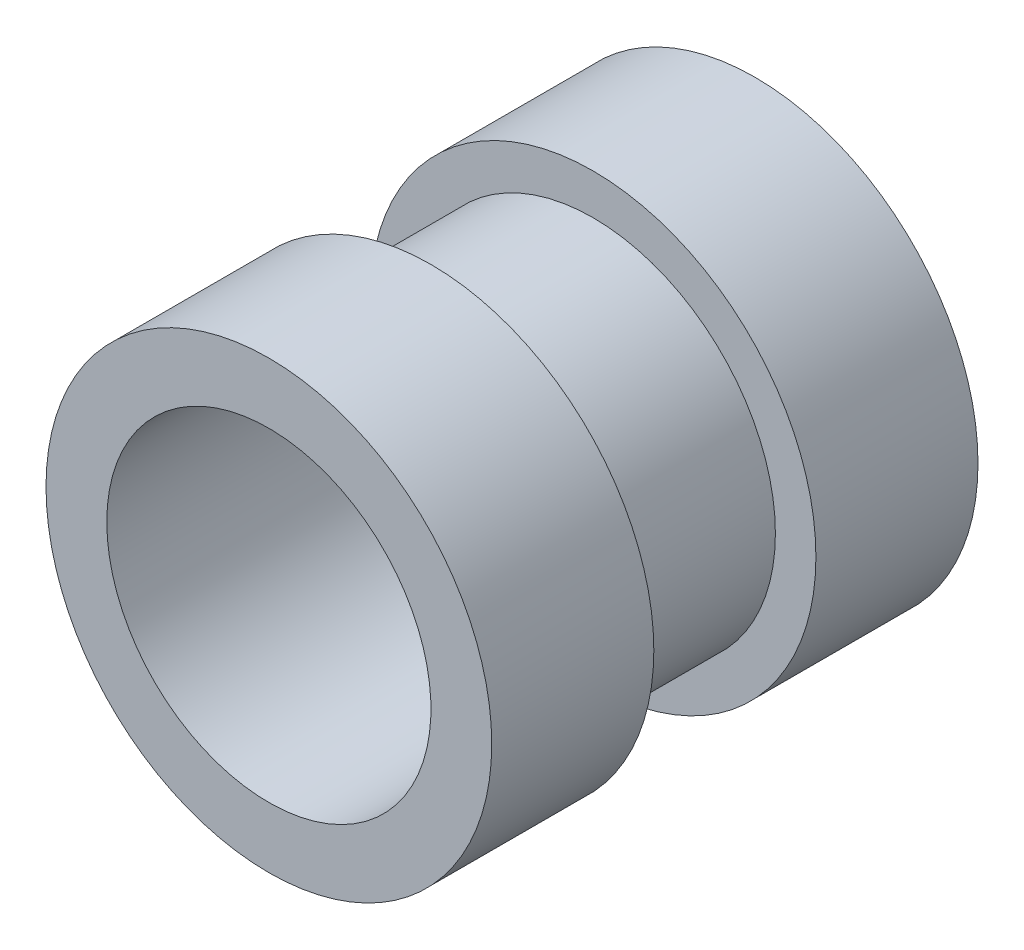
ISO-10303-21;
HEADER;
FILE_DESCRIPTION(('STEP AP214'),'2;1');
FILE_NAME('part.step','',(''),(''),'','','');
FILE_SCHEMA(('AUTOMOTIVE_DESIGN { 1 0 10303 214 1 1 1 1 }'));
ENDSEC;
DATA;
#1=APPLICATION_CONTEXT('core data for automotive mechanical design processes');
#2=APPLICATION_PROTOCOL_DEFINITION('international standard','automotive_design',2000,#1);
#3=PRODUCT_CONTEXT('',#1,'mechanical');
#4=PRODUCT('Part','Part','',(#3));
#5=PRODUCT_RELATED_PRODUCT_CATEGORY('part','',(#4));
#6=PRODUCT_DEFINITION_FORMATION('','',#4);
#7=PRODUCT_DEFINITION_CONTEXT('part definition',#1,'design');
#8=PRODUCT_DEFINITION('design','',#6,#7);
#9=PRODUCT_DEFINITION_SHAPE('','',#8);
#10=(LENGTH_UNIT() NAMED_UNIT(*) SI_UNIT(.MILLI.,.METRE.));
#11=(NAMED_UNIT(*) PLANE_ANGLE_UNIT() SI_UNIT($,.RADIAN.));
#12=(NAMED_UNIT(*) SI_UNIT($,.STERADIAN.) SOLID_ANGLE_UNIT());
#13=UNCERTAINTY_MEASURE_WITH_UNIT(LENGTH_MEASURE(1.E-05),#10,'distance_accuracy_value','');
#14=(GEOMETRIC_REPRESENTATION_CONTEXT(3) GLOBAL_UNCERTAINTY_ASSIGNED_CONTEXT((#13)) GLOBAL_UNIT_ASSIGNED_CONTEXT((#10,
#11,#12)) REPRESENTATION_CONTEXT('',''));
#15=CARTESIAN_POINT('',(0.,0.,0.));
#16=DIRECTION('',(0.,0.,1.));
#17=DIRECTION('',(1.,0.,0.));
#18=AXIS2_PLACEMENT_3D('',#15,#16,#17);
#19=CARTESIAN_POINT('',(0.,0.,0.));
#20=DIRECTION('',(0.,0.,-1.));
#21=DIRECTION('',(-1.,0.,0.));
#22=AXIS2_PLACEMENT_3D('',#19,#20,#21);
#23=PLANE('',#22);
#24=CARTESIAN_POINT('',(0.,0.,0.));
#25=DIRECTION('',(0.,0.,-1.));
#26=DIRECTION('',(-1.,0.,0.));
#27=AXIS2_PLACEMENT_3D('',#24,#25,#26);
#28=CIRCLE('',#27,2.);
#29=CARTESIAN_POINT('',(-2.,0.,0.));
#30=VERTEX_POINT('',#29);
#31=EDGE_CURVE('E60',#30,#30,#28,.T.);
#32=ORIENTED_EDGE('',*,*,#31,.T.);
#33=EDGE_LOOP('',(#32));
#34=FACE_BOUND('',#33,.T.);
#35=CARTESIAN_POINT('',(0.,0.,0.));
#36=DIRECTION('',(0.,0.,-1.));
#37=DIRECTION('',(-1.,0.,0.));
#38=AXIS2_PLACEMENT_3D('',#35,#36,#37);
#39=CIRCLE('',#38,2.75);
#40=CARTESIAN_POINT('',(-2.75,0.,0.));
#41=VERTEX_POINT('',#40);
#42=EDGE_CURVE('E10',#41,#41,#39,.T.);
#43=ORIENTED_EDGE('',*,*,#42,.F.);
#44=EDGE_LOOP('',(#43));
#45=FACE_BOUND('',#44,.T.);
#46=ADVANCED_FACE('F35',(#34,#45),#23,.F.);
#47=CARTESIAN_POINT('',(0.,0.,-11.944023292159));
#48=DIRECTION('',(0.,0.,-1.));
#49=DIRECTION('',(-1.,0.,0.));
#50=AXIS2_PLACEMENT_3D('',#47,#48,#49);
#51=CYLINDRICAL_SURFACE('',#50,2.75);
#52=CARTESIAN_POINT('',(0.,0.,-2.));
#53=DIRECTION('',(0.,0.,-1.));
#54=DIRECTION('',(-1.,0.,0.));
#55=AXIS2_PLACEMENT_3D('',#52,#53,#54);
#56=CIRCLE('',#55,2.75);
#57=CARTESIAN_POINT('',(-2.75,0.,-2.));
#58=VERTEX_POINT('',#57);
#59=EDGE_CURVE('E41',#58,#58,#56,.T.);
#60=ORIENTED_EDGE('',*,*,#59,.F.);
#61=EDGE_LOOP('',(#60));
#62=FACE_BOUND('',#61,.T.);
#63=ORIENTED_EDGE('',*,*,#42,.T.);
#64=EDGE_LOOP('',(#63));
#65=FACE_BOUND('',#64,.T.);
#66=ADVANCED_FACE('F101',(#62,#65),#51,.T.);
#67=CARTESIAN_POINT('',(2.75,0.,-2.));
#68=DIRECTION('',(0.,0.,1.));
#69=DIRECTION('',(1.,0.,0.));
#70=AXIS2_PLACEMENT_3D('',#67,#68,#69);
#71=PLANE('',#70);
#72=CARTESIAN_POINT('',(0.,0.,-2.));
#73=DIRECTION('',(0.,0.,-1.));
#74=DIRECTION('',(-1.,0.,0.));
#75=AXIS2_PLACEMENT_3D('',#72,#73,#74);
#76=CIRCLE('',#75,2.25);
#77=CARTESIAN_POINT('',(-2.25,0.,-2.));
#78=VERTEX_POINT('',#77);
#79=EDGE_CURVE('E45',#78,#78,#76,.T.);
#80=ORIENTED_EDGE('',*,*,#79,.F.);
#81=EDGE_LOOP('',(#80));
#82=FACE_BOUND('',#81,.T.);
#83=ORIENTED_EDGE('',*,*,#59,.T.);
#84=EDGE_LOOP('',(#83));
#85=FACE_BOUND('',#84,.T.);
#86=ADVANCED_FACE('F96',(#82,#85),#71,.F.);
#87=CARTESIAN_POINT('',(0.,0.,-11.944023292159));
#88=DIRECTION('',(0.,0.,-1.));
#89=DIRECTION('',(-1.,0.,0.));
#90=AXIS2_PLACEMENT_3D('',#87,#88,#89);
#91=CYLINDRICAL_SURFACE('',#90,2.25);
#92=CARTESIAN_POINT('',(0.,0.,-4.));
#93=DIRECTION('',(0.,0.,-1.));
#94=DIRECTION('',(-1.,0.,0.));
#95=AXIS2_PLACEMENT_3D('',#92,#93,#94);
#96=CIRCLE('',#95,2.25);
#97=CARTESIAN_POINT('',(-2.25,0.,-4.));
#98=VERTEX_POINT('',#97);
#99=EDGE_CURVE('E49',#98,#98,#96,.T.);
#100=ORIENTED_EDGE('',*,*,#99,.F.);
#101=EDGE_LOOP('',(#100));
#102=FACE_BOUND('',#101,.T.);
#103=ORIENTED_EDGE('',*,*,#79,.T.);
#104=EDGE_LOOP('',(#103));
#105=FACE_BOUND('',#104,.T.);
#106=ADVANCED_FACE('F90',(#102,#105),#91,.T.);
#107=CARTESIAN_POINT('',(2.25,0.,-4.));
#108=DIRECTION('',(0.,0.,-1.));
#109=DIRECTION('',(-1.,0.,0.));
#110=AXIS2_PLACEMENT_3D('',#107,#108,#109);
#111=PLANE('',#110);
#112=CARTESIAN_POINT('',(0.,0.,-4.));
#113=DIRECTION('',(0.,0.,-1.));
#114=DIRECTION('',(-1.,0.,0.));
#115=AXIS2_PLACEMENT_3D('',#112,#113,#114);
#116=CIRCLE('',#115,2.75);
#117=CARTESIAN_POINT('',(-2.75,0.,-4.));
#118=VERTEX_POINT('',#117);
#119=EDGE_CURVE('E54',#118,#118,#116,.T.);
#120=ORIENTED_EDGE('',*,*,#119,.F.);
#121=EDGE_LOOP('',(#120));
#122=FACE_BOUND('',#121,.T.);
#123=ORIENTED_EDGE('',*,*,#99,.T.);
#124=EDGE_LOOP('',(#123));
#125=FACE_BOUND('',#124,.T.);
#126=ADVANCED_FACE('F84',(#122,#125),#111,.F.);
#127=CARTESIAN_POINT('',(0.,0.,-11.944023292159));
#128=DIRECTION('',(0.,0.,-1.));
#129=DIRECTION('',(-1.,0.,0.));
#130=AXIS2_PLACEMENT_3D('',#127,#128,#129);
#131=CYLINDRICAL_SURFACE('',#130,2.75);
#132=CARTESIAN_POINT('',(0.,0.,-6.));
#133=DIRECTION('',(0.,0.,-1.));
#134=DIRECTION('',(-1.,0.,0.));
#135=AXIS2_PLACEMENT_3D('',#132,#133,#134);
#136=CIRCLE('',#135,2.75);
#137=CARTESIAN_POINT('',(-2.75,0.,-6.));
#138=VERTEX_POINT('',#137);
#139=EDGE_CURVE('E57',#138,#138,#136,.T.);
#140=ORIENTED_EDGE('',*,*,#139,.F.);
#141=EDGE_LOOP('',(#140));
#142=FACE_BOUND('',#141,.T.);
#143=ORIENTED_EDGE('',*,*,#119,.T.);
#144=EDGE_LOOP('',(#143));
#145=FACE_BOUND('',#144,.T.);
#146=ADVANCED_FACE('F78',(#142,#145),#131,.T.);
#147=CARTESIAN_POINT('',(2.75,0.,-6.));
#148=DIRECTION('',(0.,0.,1.));
#149=DIRECTION('',(1.,0.,0.));
#150=AXIS2_PLACEMENT_3D('',#147,#148,#149);
#151=PLANE('',#150);
#152=CARTESIAN_POINT('',(0.,0.,-6.));
#153=DIRECTION('',(0.,0.,-1.));
#154=DIRECTION('',(-1.,0.,0.));
#155=AXIS2_PLACEMENT_3D('',#152,#153,#154);
#156=CIRCLE('',#155,2.);
#157=CARTESIAN_POINT('',(-2.,0.,-6.));
#158=VERTEX_POINT('',#157);
#159=EDGE_CURVE('E61',#158,#158,#156,.T.);
#160=ORIENTED_EDGE('',*,*,#159,.F.);
#161=EDGE_LOOP('',(#160));
#162=FACE_BOUND('',#161,.T.);
#163=ORIENTED_EDGE('',*,*,#139,.T.);
#164=EDGE_LOOP('',(#163));
#165=FACE_BOUND('',#164,.T.);
#166=ADVANCED_FACE('F72',(#162,#165),#151,.F.);
#167=CARTESIAN_POINT('',(0.,0.,0.));
#168=DIRECTION('',(0.,0.,-1.));
#169=DIRECTION('',(-1.,0.,0.));
#170=AXIS2_PLACEMENT_3D('',#167,#168,#169);
#171=CYLINDRICAL_SURFACE('',#170,2.);
#172=ORIENTED_EDGE('',*,*,#31,.F.);
#173=EDGE_LOOP('',(#172));
#174=FACE_BOUND('',#173,.T.);
#175=ORIENTED_EDGE('',*,*,#159,.T.);
#176=EDGE_LOOP('',(#175));
#177=FACE_BOUND('',#176,.T.);
#178=ADVANCED_FACE('F69',(#174,#177),#171,.F.);
#179=CLOSED_SHELL('',(#46,#66,#86,#106,#126,#146,#166,#178));
#180=MANIFOLD_SOLID_BREP('B2',#179);
#181=ADVANCED_BREP_SHAPE_REPRESENTATION('',(#18,#180),#14);
#182=SHAPE_DEFINITION_REPRESENTATION(#9,#181);
ENDSEC;
END-ISO-10303-21;
